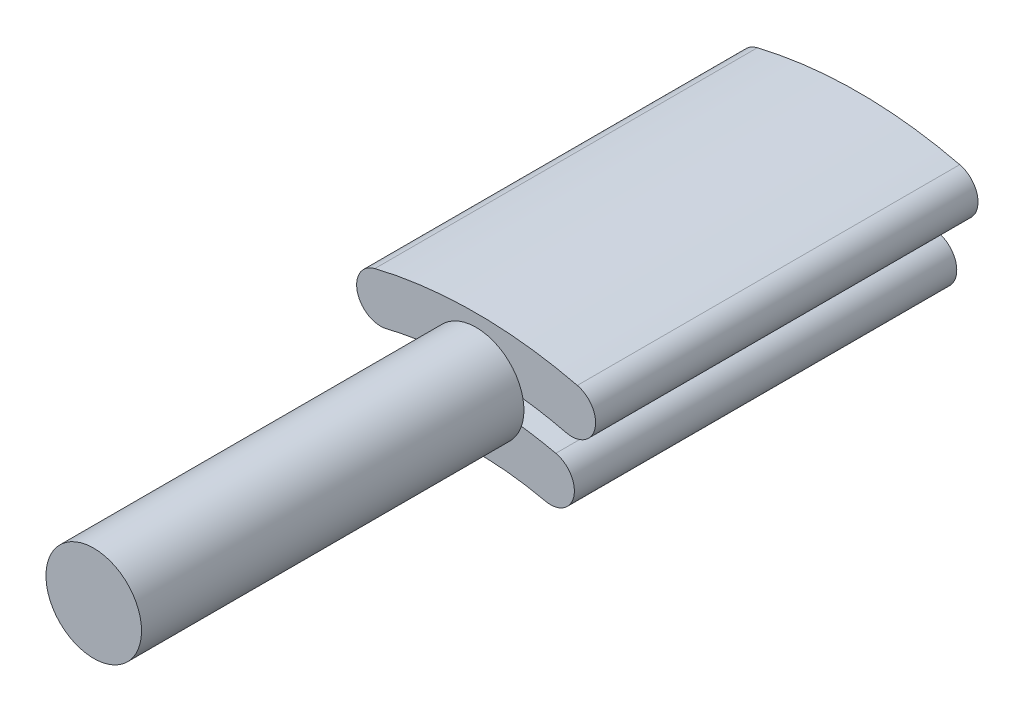
ISO-10303-21;
HEADER;
FILE_DESCRIPTION(('STEP AP214'),'2;1');
FILE_NAME('part.step','',(''),(''),'','','');
FILE_SCHEMA(('AUTOMOTIVE_DESIGN { 1 0 10303 214 1 1 1 1 }'));
ENDSEC;
DATA;
#1=APPLICATION_CONTEXT('core data for automotive mechanical design processes');
#2=APPLICATION_PROTOCOL_DEFINITION('international standard','automotive_design',2000,#1);
#3=PRODUCT_CONTEXT('',#1,'mechanical');
#4=PRODUCT('Part','Part','',(#3));
#5=PRODUCT_RELATED_PRODUCT_CATEGORY('part','',(#4));
#6=PRODUCT_DEFINITION_FORMATION('','',#4);
#7=PRODUCT_DEFINITION_CONTEXT('part definition',#1,'design');
#8=PRODUCT_DEFINITION('design','',#6,#7);
#9=PRODUCT_DEFINITION_SHAPE('','',#8);
#10=(LENGTH_UNIT() NAMED_UNIT(*) SI_UNIT(.MILLI.,.METRE.));
#11=(NAMED_UNIT(*) PLANE_ANGLE_UNIT() SI_UNIT($,.RADIAN.));
#12=(NAMED_UNIT(*) SI_UNIT($,.STERADIAN.) SOLID_ANGLE_UNIT());
#13=UNCERTAINTY_MEASURE_WITH_UNIT(LENGTH_MEASURE(1.E-05),#10,'distance_accuracy_value','');
#14=(GEOMETRIC_REPRESENTATION_CONTEXT(3) GLOBAL_UNCERTAINTY_ASSIGNED_CONTEXT((#13)) GLOBAL_UNIT_ASSIGNED_CONTEXT((#10,
#11,#12)) REPRESENTATION_CONTEXT('',''));
#15=CARTESIAN_POINT('',(0.,0.,0.));
#16=DIRECTION('',(0.,0.,1.));
#17=DIRECTION('',(1.,0.,0.));
#18=AXIS2_PLACEMENT_3D('',#15,#16,#17);
#19=CARTESIAN_POINT('',(-12.7,52.4596094629001,-50.8));
#20=DIRECTION('',(0.,0.,1.));
#21=DIRECTION('',(1.,0.,0.));
#22=AXIS2_PLACEMENT_3D('',#19,#20,#21);
#23=CYLINDRICAL_SURFACE('',#22,3.17499999999999);
#24=CARTESIAN_POINT('',(-12.7,52.4596094629001,0.));
#25=DIRECTION('',(0.,0.,1.));
#26=DIRECTION('',(1.,0.,0.));
#27=AXIS2_PLACEMENT_3D('',#24,#25,#26);
#28=CIRCLE('',#27,3.17499999999999);
#29=CARTESIAN_POINT('',(-13.4470588235294,55.5454688430707,0.));
#30=VERTEX_POINT('',#29);
#31=CARTESIAN_POINT('',(-11.9529411764706,49.3737500827295,0.));
#32=VERTEX_POINT('',#31);
#33=EDGE_CURVE('E178',#30,#32,#28,.T.);
#34=ORIENTED_EDGE('',*,*,#33,.F.);
#35=DIRECTION('',(0.,0.,1.));
#36=VECTOR('',#35,1.);
#37=CARTESIAN_POINT('',(-13.4470588235294,55.5454688430707,-50.8));
#38=LINE('',#37,#36);
#39=CARTESIAN_POINT('',(-13.4470588235294,55.5454688430707,-50.8));
#40=VERTEX_POINT('',#39);
#41=EDGE_CURVE('E11',#40,#30,#38,.T.);
#42=ORIENTED_EDGE('',*,*,#41,.F.);
#43=CARTESIAN_POINT('',(-12.7,52.4596094629001,-50.8));
#44=DIRECTION('',(0.,0.,1.));
#45=DIRECTION('',(1.,0.,0.));
#46=AXIS2_PLACEMENT_3D('',#43,#44,#45);
#47=CIRCLE('',#46,3.17499999999999);
#48=CARTESIAN_POINT('',(-11.9529411764706,49.3737500827295,-50.8));
#49=VERTEX_POINT('',#48);
#50=EDGE_CURVE('E183',#40,#49,#47,.T.);
#51=ORIENTED_EDGE('',*,*,#50,.T.);
#52=DIRECTION('',(0.,0.,1.));
#53=VECTOR('',#52,1.);
#54=CARTESIAN_POINT('',(-11.9529411764706,49.3737500827295,-50.8));
#55=LINE('',#54,#53);
#56=EDGE_CURVE('E42',#49,#32,#55,.T.);
#57=ORIENTED_EDGE('',*,*,#56,.T.);
#58=EDGE_LOOP('',(#34,#42,#51,#57));
#59=FACE_BOUND('',#58,.T.);
#60=ADVANCED_FACE('F39',(#59),#23,.T.);
#61=CARTESIAN_POINT('',(0.,0.,-50.8));
#62=DIRECTION('',(0.,0.,1.));
#63=DIRECTION('',(1.,0.,0.));
#64=AXIS2_PLACEMENT_3D('',#61,#62,#63);
#65=CYLINDRICAL_SURFACE('',#64,57.15);
#66=CARTESIAN_POINT('',(0.,0.,0.));
#67=DIRECTION('',(0.,0.,1.));
#68=DIRECTION('',(-1.,0.,0.));
#69=AXIS2_PLACEMENT_3D('',#66,#67,#68);
#70=CIRCLE('',#69,57.15);
#71=CARTESIAN_POINT('',(13.4470588235294,55.5454688430707,0.));
#72=VERTEX_POINT('',#71);
#73=EDGE_CURVE('E188',#72,#30,#70,.T.);
#74=ORIENTED_EDGE('',*,*,#73,.F.);
#75=DIRECTION('',(0.,0.,1.));
#76=VECTOR('',#75,1.);
#77=CARTESIAN_POINT('',(13.4470588235294,55.5454688430707,-50.8));
#78=LINE('',#77,#76);
#79=CARTESIAN_POINT('',(13.4470588235294,55.5454688430707,-50.8));
#80=VERTEX_POINT('',#79);
#81=EDGE_CURVE('E48',#80,#72,#78,.T.);
#82=ORIENTED_EDGE('',*,*,#81,.F.);
#83=CARTESIAN_POINT('',(0.,0.,-50.8));
#84=DIRECTION('',(0.,0.,1.));
#85=DIRECTION('',(-1.,0.,0.));
#86=AXIS2_PLACEMENT_3D('',#83,#84,#85);
#87=CIRCLE('',#86,57.15);
#88=EDGE_CURVE('E196',#80,#40,#87,.T.);
#89=ORIENTED_EDGE('',*,*,#88,.T.);
#90=ORIENTED_EDGE('',*,*,#41,.T.);
#91=EDGE_LOOP('',(#74,#82,#89,#90));
#92=FACE_BOUND('',#91,.T.);
#93=ADVANCED_FACE('F236',(#92),#65,.T.);
#94=CARTESIAN_POINT('',(12.7,52.4596094629001,-50.8));
#95=DIRECTION('',(0.,0.,1.));
#96=DIRECTION('',(1.,0.,0.));
#97=AXIS2_PLACEMENT_3D('',#94,#95,#96);
#98=CYLINDRICAL_SURFACE('',#97,3.17499999999999);
#99=CARTESIAN_POINT('',(12.7,52.4596094629001,0.));
#100=DIRECTION('',(0.,0.,1.));
#101=DIRECTION('',(-1.,0.,0.));
#102=AXIS2_PLACEMENT_3D('',#99,#100,#101);
#103=CIRCLE('',#102,3.17499999999999);
#104=CARTESIAN_POINT('',(11.9529411764706,49.3737500827295,0.));
#105=VERTEX_POINT('',#104);
#106=EDGE_CURVE('E207',#105,#72,#103,.T.);
#107=ORIENTED_EDGE('',*,*,#106,.F.);
#108=DIRECTION('',(0.,0.,1.));
#109=VECTOR('',#108,1.);
#110=CARTESIAN_POINT('',(11.9529411764706,49.3737500827295,-50.8));
#111=LINE('',#110,#109);
#112=CARTESIAN_POINT('',(11.9529411764706,49.3737500827295,-50.8));
#113=VERTEX_POINT('',#112);
#114=EDGE_CURVE('E216',#113,#105,#111,.T.);
#115=ORIENTED_EDGE('',*,*,#114,.F.);
#116=CARTESIAN_POINT('',(12.7,52.4596094629001,-50.8));
#117=DIRECTION('',(0.,0.,1.));
#118=DIRECTION('',(-1.,0.,0.));
#119=AXIS2_PLACEMENT_3D('',#116,#117,#118);
#120=CIRCLE('',#119,3.17499999999999);
#121=EDGE_CURVE('E192',#113,#80,#120,.T.);
#122=ORIENTED_EDGE('',*,*,#121,.T.);
#123=ORIENTED_EDGE('',*,*,#81,.T.);
#124=EDGE_LOOP('',(#107,#115,#122,#123));
#125=FACE_BOUND('',#124,.T.);
#126=ADVANCED_FACE('F242',(#125),#98,.T.);
#127=CARTESIAN_POINT('',(0.,0.,-50.8));
#128=DIRECTION('',(0.,0.,1.));
#129=DIRECTION('',(1.,0.,0.));
#130=AXIS2_PLACEMENT_3D('',#127,#128,#129);
#131=CYLINDRICAL_SURFACE('',#130,50.8);
#132=CARTESIAN_POINT('',(0.,0.,0.));
#133=DIRECTION('',(0.,0.,-1.));
#134=DIRECTION('',(-1.,0.,0.));
#135=AXIS2_PLACEMENT_3D('',#132,#133,#134);
#136=CIRCLE('',#135,50.8);
#137=CARTESIAN_POINT('',(-6.2220052032652,50.4175232558139,0.));
#138=VERTEX_POINT('',#137);
#139=EDGE_CURVE('E204',#32,#138,#136,.T.);
#140=ORIENTED_EDGE('',*,*,#139,.F.);
#141=ORIENTED_EDGE('',*,*,#56,.F.);
#142=CARTESIAN_POINT('',(0.,0.,-50.8));
#143=DIRECTION('',(0.,0.,-1.));
#144=DIRECTION('',(-1.,0.,0.));
#145=AXIS2_PLACEMENT_3D('',#142,#143,#144);
#146=CIRCLE('',#145,50.8);
#147=EDGE_CURVE('E187',#49,#113,#146,.T.);
#148=ORIENTED_EDGE('',*,*,#147,.T.);
#149=ORIENTED_EDGE('',*,*,#114,.T.);
#150=CARTESIAN_POINT('',(6.22200520326526,50.4175232558139,0.));
#151=VERTEX_POINT('',#150);
#152=EDGE_CURVE('E203',#151,#105,#136,.T.);
#153=ORIENTED_EDGE('',*,*,#152,.F.);
#154=EDGE_CURVE('E208',#138,#151,#136,.T.);
#155=ORIENTED_EDGE('',*,*,#154,.F.);
#156=EDGE_LOOP('',(#140,#141,#148,#149,#153,#155));
#157=FACE_BOUND('',#156,.T.);
#158=ADVANCED_FACE('F229',(#157),#131,.F.);
#159=CARTESIAN_POINT('',(-6.35,26.2298047314501,-50.8));
#160=DIRECTION('',(0.,0.,1.));
#161=DIRECTION('',(1.,0.,0.));
#162=AXIS2_PLACEMENT_3D('',#159,#160,#161);
#163=PLANE('',#162);
#164=ORIENTED_EDGE('',*,*,#50,.F.);
#165=ORIENTED_EDGE('',*,*,#88,.F.);
#166=ORIENTED_EDGE('',*,*,#121,.F.);
#167=ORIENTED_EDGE('',*,*,#147,.F.);
#168=EDGE_LOOP('',(#164,#165,#166,#167));
#169=FACE_BOUND('',#168,.T.);
#170=ADVANCED_FACE('F239',(#169),#163,.F.);
#171=CARTESIAN_POINT('',(-6.35,26.2298047314501,0.));
#172=DIRECTION('',(0.,0.,1.));
#173=DIRECTION('',(1.,0.,0.));
#174=AXIS2_PLACEMENT_3D('',#171,#172,#173);
#175=PLANE('',#174);
#176=CARTESIAN_POINT('',(0.,49.149,0.));
#177=DIRECTION('',(0.,0.,1.));
#178=DIRECTION('',(1.,0.,0.));
#179=AXIS2_PLACEMENT_3D('',#176,#177,#178);
#180=CIRCLE('',#179,6.35);
#181=EDGE_CURVE('E179',#151,#138,#180,.T.);
#182=ORIENTED_EDGE('',*,*,#181,.F.);
#183=ORIENTED_EDGE('',*,*,#152,.T.);
#184=ORIENTED_EDGE('',*,*,#106,.T.);
#185=ORIENTED_EDGE('',*,*,#73,.T.);
#186=ORIENTED_EDGE('',*,*,#33,.T.);
#187=ORIENTED_EDGE('',*,*,#139,.T.);
#188=EDGE_LOOP('',(#182,#183,#184,#185,#186,#187));
#189=FACE_BOUND('',#188,.T.);
#190=ADVANCED_FACE('F233',(#189),#175,.T.);
#191=CARTESIAN_POINT('',(0.,49.149,0.));
#192=DIRECTION('',(0.,0.,1.));
#193=DIRECTION('',(1.,0.,0.));
#194=AXIS2_PLACEMENT_3D('',#191,#192,#193);
#195=PLANE('',#194);
#196=CARTESIAN_POINT('',(6.01560240797665,47.115523255814,0.));
#197=VERTEX_POINT('',#196);
#198=EDGE_CURVE('E64',#197,#151,#180,.T.);
#199=ORIENTED_EDGE('',*,*,#198,.F.);
#200=CARTESIAN_POINT('',(0.,0.,0.));
#201=DIRECTION('',(0.,0.,1.));
#202=DIRECTION('',(-1.,0.,0.));
#203=AXIS2_PLACEMENT_3D('',#200,#201,#202);
#204=CIRCLE('',#203,47.498);
#205=CARTESIAN_POINT('',(-6.01560240797666,47.115523255814,0.));
#206=VERTEX_POINT('',#205);
#207=EDGE_CURVE('E151',#197,#206,#204,.T.);
#208=ORIENTED_EDGE('',*,*,#207,.T.);
#209=EDGE_CURVE('E182',#138,#206,#180,.T.);
#210=ORIENTED_EDGE('',*,*,#209,.F.);
#211=ORIENTED_EDGE('',*,*,#154,.T.);
#212=EDGE_LOOP('',(#199,#208,#210,#211));
#213=FACE_BOUND('',#212,.T.);
#214=ADVANCED_FACE('F284',(#213),#195,.F.);
#215=CARTESIAN_POINT('',(0.,49.149,50.8));
#216=DIRECTION('',(0.,0.,-1.));
#217=DIRECTION('',(-1.,0.,0.));
#218=AXIS2_PLACEMENT_3D('',#215,#216,#217);
#219=CYLINDRICAL_SURFACE('',#218,6.35);
#220=CARTESIAN_POINT('',(0.,49.149,50.8));
#221=DIRECTION('',(0.,0.,1.));
#222=DIRECTION('',(1.,0.,0.));
#223=AXIS2_PLACEMENT_3D('',#220,#221,#222);
#224=CIRCLE('',#223,6.35);
#225=CARTESIAN_POINT('',(6.35,49.149,50.8));
#226=VERTEX_POINT('',#225);
#227=EDGE_CURVE('E174',#226,#226,#224,.T.);
#228=ORIENTED_EDGE('',*,*,#227,.F.);
#229=EDGE_LOOP('',(#228));
#230=FACE_BOUND('',#229,.T.);
#231=ORIENTED_EDGE('',*,*,#181,.T.);
#232=ORIENTED_EDGE('',*,*,#209,.T.);
#233=EDGE_CURVE('E370',#206,#197,#180,.T.);
#234=ORIENTED_EDGE('',*,*,#233,.T.);
#235=ORIENTED_EDGE('',*,*,#198,.T.);
#236=EDGE_LOOP('',(#231,#232,#234,#235));
#237=FACE_BOUND('',#236,.T.);
#238=ADVANCED_FACE('F294',(#230,#237),#219,.T.);
#239=CARTESIAN_POINT('',(0.,49.149,50.8));
#240=DIRECTION('',(0.,0.,1.));
#241=DIRECTION('',(1.,0.,0.));
#242=AXIS2_PLACEMENT_3D('',#239,#240,#241);
#243=PLANE('',#242);
#244=ORIENTED_EDGE('',*,*,#227,.T.);
#245=EDGE_LOOP('',(#244));
#246=FACE_BOUND('',#245,.T.);
#247=ADVANCED_FACE('F305',(#246),#243,.T.);
#248=CARTESIAN_POINT('',(-9.87862872169844,43.2081129370265,-50.8));
#249=DIRECTION('',(0.,0.,1.));
#250=DIRECTION('',(1.,0.,0.));
#251=AXIS2_PLACEMENT_3D('',#248,#249,#250);
#252=CYLINDRICAL_SURFACE('',#251,3.175);
#253=CARTESIAN_POINT('',(-9.87862872169844,43.2081129370265,0.));
#254=DIRECTION('',(0.,0.,1.));
#255=DIRECTION('',(1.,0.,0.));
#256=AXIS2_PLACEMENT_3D('',#253,#254,#255);
#257=CIRCLE('',#256,3.175);
#258=CARTESIAN_POINT('',(-10.5862668822786,46.3032499668994,0.));
#259=VERTEX_POINT('',#258);
#260=CARTESIAN_POINT('',(-9.17099056111833,40.1129759071535,0.));
#261=VERTEX_POINT('',#260);
#262=EDGE_CURVE('E159',#259,#261,#257,.T.);
#263=ORIENTED_EDGE('',*,*,#262,.F.);
#264=DIRECTION('',(0.,0.,1.));
#265=VECTOR('',#264,1.);
#266=CARTESIAN_POINT('',(-10.5862668822786,46.3032499668994,-50.8));
#267=LINE('',#266,#265);
#268=CARTESIAN_POINT('',(-10.5862668822786,46.3032499668994,-50.8));
#269=VERTEX_POINT('',#268);
#270=EDGE_CURVE('E147',#269,#259,#267,.T.);
#271=ORIENTED_EDGE('',*,*,#270,.F.);
#272=CARTESIAN_POINT('',(-9.87862872169844,43.2081129370265,-50.8));
#273=DIRECTION('',(0.,0.,1.));
#274=DIRECTION('',(1.,0.,0.));
#275=AXIS2_PLACEMENT_3D('',#272,#273,#274);
#276=CIRCLE('',#275,3.175);
#277=CARTESIAN_POINT('',(-9.17099056111833,40.1129759071535,-50.8));
#278=VERTEX_POINT('',#277);
#279=EDGE_CURVE('E139',#269,#278,#276,.T.);
#280=ORIENTED_EDGE('',*,*,#279,.T.);
#281=DIRECTION('',(0.,0.,1.));
#282=VECTOR('',#281,1.);
#283=CARTESIAN_POINT('',(-9.17099056111833,40.1129759071535,-50.8));
#284=LINE('',#283,#282);
#285=EDGE_CURVE('E120',#278,#261,#284,.T.);
#286=ORIENTED_EDGE('',*,*,#285,.T.);
#287=EDGE_LOOP('',(#263,#271,#280,#286));
#288=FACE_BOUND('',#287,.T.);
#289=ADVANCED_FACE('F145',(#288),#252,.T.);
#290=CARTESIAN_POINT('',(0.,0.,-50.8));
#291=DIRECTION('',(0.,0.,1.));
#292=DIRECTION('',(1.,0.,0.));
#293=AXIS2_PLACEMENT_3D('',#290,#291,#292);
#294=CYLINDRICAL_SURFACE('',#293,47.498);
#295=CARTESIAN_POINT('',(10.5862668822786,46.3032499668994,0.));
#296=VERTEX_POINT('',#295);
#297=EDGE_CURVE('E56',#296,#197,#204,.T.);
#298=ORIENTED_EDGE('',*,*,#297,.F.);
#299=DIRECTION('',(0.,0.,1.));
#300=VECTOR('',#299,1.);
#301=CARTESIAN_POINT('',(10.5862668822786,46.3032499668994,-50.8));
#302=LINE('',#301,#300);
#303=CARTESIAN_POINT('',(10.5862668822786,46.3032499668994,-50.8));
#304=VERTEX_POINT('',#303);
#305=EDGE_CURVE('E169',#304,#296,#302,.T.);
#306=ORIENTED_EDGE('',*,*,#305,.F.);
#307=CARTESIAN_POINT('',(0.,0.,-50.8));
#308=DIRECTION('',(0.,0.,1.));
#309=DIRECTION('',(-1.,0.,0.));
#310=AXIS2_PLACEMENT_3D('',#307,#308,#309);
#311=CIRCLE('',#310,47.498);
#312=EDGE_CURVE('E132',#304,#269,#311,.T.);
#313=ORIENTED_EDGE('',*,*,#312,.T.);
#314=ORIENTED_EDGE('',*,*,#270,.T.);
#315=EDGE_CURVE('E153',#206,#259,#204,.T.);
#316=ORIENTED_EDGE('',*,*,#315,.F.);
#317=ORIENTED_EDGE('',*,*,#207,.F.);
#318=EDGE_LOOP('',(#298,#306,#313,#314,#316,#317));
#319=FACE_BOUND('',#318,.T.);
#320=ADVANCED_FACE('F323',(#319),#294,.T.);
#321=CARTESIAN_POINT('',(9.87862872169844,43.2081129370265,-50.8));
#322=DIRECTION('',(0.,0.,1.));
#323=DIRECTION('',(1.,0.,0.));
#324=AXIS2_PLACEMENT_3D('',#321,#322,#323);
#325=CYLINDRICAL_SURFACE('',#324,3.175);
#326=CARTESIAN_POINT('',(9.87862872169844,43.2081129370265,0.));
#327=DIRECTION('',(0.,0.,1.));
#328=DIRECTION('',(-1.,0.,0.));
#329=AXIS2_PLACEMENT_3D('',#326,#327,#328);
#330=CIRCLE('',#329,3.175);
#331=CARTESIAN_POINT('',(9.17099056111833,40.1129759071535,0.));
#332=VERTEX_POINT('',#331);
#333=EDGE_CURVE('E164',#332,#296,#330,.T.);
#334=ORIENTED_EDGE('',*,*,#333,.F.);
#335=DIRECTION('',(0.,0.,1.));
#336=VECTOR('',#335,1.);
#337=CARTESIAN_POINT('',(9.17099056111833,40.1129759071535,-50.8));
#338=LINE('',#337,#336);
#339=CARTESIAN_POINT('',(9.17099056111833,40.1129759071535,-50.8));
#340=VERTEX_POINT('',#339);
#341=EDGE_CURVE('E131',#340,#332,#338,.T.);
#342=ORIENTED_EDGE('',*,*,#341,.F.);
#343=CARTESIAN_POINT('',(9.87862872169844,43.2081129370265,-50.8));
#344=DIRECTION('',(0.,0.,1.));
#345=DIRECTION('',(-1.,0.,0.));
#346=AXIS2_PLACEMENT_3D('',#343,#344,#345);
#347=CIRCLE('',#346,3.175);
#348=EDGE_CURVE('E142',#340,#304,#347,.T.);
#349=ORIENTED_EDGE('',*,*,#348,.T.);
#350=ORIENTED_EDGE('',*,*,#305,.T.);
#351=EDGE_LOOP('',(#334,#342,#349,#350));
#352=FACE_BOUND('',#351,.T.);
#353=ADVANCED_FACE('F332',(#352),#325,.T.);
#354=CARTESIAN_POINT('',(0.,0.,-50.8));
#355=DIRECTION('',(0.,0.,1.));
#356=DIRECTION('',(1.,0.,0.));
#357=AXIS2_PLACEMENT_3D('',#354,#355,#356);
#358=CYLINDRICAL_SURFACE('',#357,41.148);
#359=CARTESIAN_POINT('',(0.,0.,0.));
#360=DIRECTION('',(0.,0.,-1.));
#361=DIRECTION('',(-1.,0.,0.));
#362=AXIS2_PLACEMENT_3D('',#359,#360,#361);
#363=CIRCLE('',#362,41.148);
#364=EDGE_CURVE('E125',#261,#332,#363,.T.);
#365=ORIENTED_EDGE('',*,*,#364,.F.);
#366=ORIENTED_EDGE('',*,*,#285,.F.);
#367=CARTESIAN_POINT('',(0.,0.,-50.8));
#368=DIRECTION('',(0.,0.,-1.));
#369=DIRECTION('',(-1.,0.,0.));
#370=AXIS2_PLACEMENT_3D('',#367,#368,#369);
#371=CIRCLE('',#370,41.148);
#372=EDGE_CURVE('E123',#278,#340,#371,.T.);
#373=ORIENTED_EDGE('',*,*,#372,.T.);
#374=ORIENTED_EDGE('',*,*,#341,.T.);
#375=EDGE_LOOP('',(#365,#366,#373,#374));
#376=FACE_BOUND('',#375,.T.);
#377=ADVANCED_FACE('F122',(#376),#358,.F.);
#378=CARTESIAN_POINT('',(-4.93931436084922,21.6040564685132,-50.8));
#379=DIRECTION('',(0.,0.,1.));
#380=DIRECTION('',(1.,0.,0.));
#381=AXIS2_PLACEMENT_3D('',#378,#379,#380);
#382=PLANE('',#381);
#383=ORIENTED_EDGE('',*,*,#279,.F.);
#384=ORIENTED_EDGE('',*,*,#312,.F.);
#385=ORIENTED_EDGE('',*,*,#348,.F.);
#386=ORIENTED_EDGE('',*,*,#372,.F.);
#387=EDGE_LOOP('',(#383,#384,#385,#386));
#388=FACE_BOUND('',#387,.T.);
#389=ADVANCED_FACE('F137',(#388),#382,.F.);
#390=CARTESIAN_POINT('',(-4.93931436084922,21.6040564685132,0.));
#391=DIRECTION('',(0.,0.,1.));
#392=DIRECTION('',(1.,0.,0.));
#393=AXIS2_PLACEMENT_3D('',#390,#391,#392);
#394=PLANE('',#393);
#395=ORIENTED_EDGE('',*,*,#233,.F.);
#396=ORIENTED_EDGE('',*,*,#315,.T.);
#397=ORIENTED_EDGE('',*,*,#262,.T.);
#398=ORIENTED_EDGE('',*,*,#364,.T.);
#399=ORIENTED_EDGE('',*,*,#333,.T.);
#400=ORIENTED_EDGE('',*,*,#297,.T.);
#401=EDGE_LOOP('',(#395,#396,#397,#398,#399,#400));
#402=FACE_BOUND('',#401,.T.);
#403=ADVANCED_FACE('F359',(#402),#394,.T.);
#404=CLOSED_SHELL('',(#60,#93,#126,#158,#170,#190,#214,#238,#247,#289,#320,#353,#377,#389,#403));
#405=MANIFOLD_SOLID_BREP('B2',#404);
#406=ADVANCED_BREP_SHAPE_REPRESENTATION('',(#18,#405),#14);
#407=SHAPE_DEFINITION_REPRESENTATION(#9,#406);
ENDSEC;
END-ISO-10303-21;
